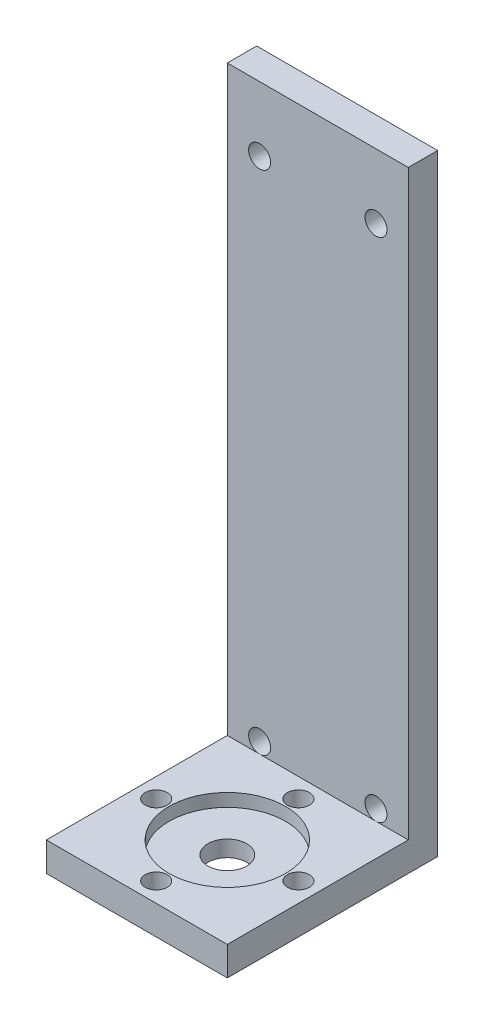
ISO-10303-21;
HEADER;
FILE_DESCRIPTION(('STEP AP214'),'2;1');
FILE_NAME('part.step','',(''),(''),'','','');
FILE_SCHEMA(('AUTOMOTIVE_DESIGN { 1 0 10303 214 1 1 1 1 }'));
ENDSEC;
DATA;
#1=APPLICATION_CONTEXT('core data for automotive mechanical design processes');
#2=APPLICATION_PROTOCOL_DEFINITION('international standard','automotive_design',2000,#1);
#3=PRODUCT_CONTEXT('',#1,'mechanical');
#4=PRODUCT('Part','Part','',(#3));
#5=PRODUCT_RELATED_PRODUCT_CATEGORY('part','',(#4));
#6=PRODUCT_DEFINITION_FORMATION('','',#4);
#7=PRODUCT_DEFINITION_CONTEXT('part definition',#1,'design');
#8=PRODUCT_DEFINITION('design','',#6,#7);
#9=PRODUCT_DEFINITION_SHAPE('','',#8);
#10=(LENGTH_UNIT() NAMED_UNIT(*) SI_UNIT(.MILLI.,.METRE.));
#11=(NAMED_UNIT(*) PLANE_ANGLE_UNIT() SI_UNIT($,.RADIAN.));
#12=(NAMED_UNIT(*) SI_UNIT($,.STERADIAN.) SOLID_ANGLE_UNIT());
#13=UNCERTAINTY_MEASURE_WITH_UNIT(LENGTH_MEASURE(1.E-05),#10,'distance_accuracy_value','');
#14=(GEOMETRIC_REPRESENTATION_CONTEXT(3) GLOBAL_UNCERTAINTY_ASSIGNED_CONTEXT((#13)) GLOBAL_UNIT_ASSIGNED_CONTEXT((#10,
#11,#12)) REPRESENTATION_CONTEXT('',''));
#15=CARTESIAN_POINT('',(0.,0.,0.));
#16=DIRECTION('',(0.,0.,1.));
#17=DIRECTION('',(1.,0.,0.));
#18=AXIS2_PLACEMENT_3D('',#15,#16,#17);
#19=CARTESIAN_POINT('',(14.,4.5,-14.));
#20=DIRECTION('',(0.,-1.,0.));
#21=DIRECTION('',(0.,0.,-1.));
#22=AXIS2_PLACEMENT_3D('',#19,#20,#21);
#23=CYLINDRICAL_SURFACE('',#22,3.);
#24=CARTESIAN_POINT('',(14.,0.,-14.));
#25=DIRECTION('',(0.,1.,0.));
#26=DIRECTION('',(0.,0.,1.));
#27=AXIS2_PLACEMENT_3D('',#24,#25,#26);
#28=CIRCLE('',#27,3.);
#29=CARTESIAN_POINT('',(14.,0.,-11.));
#30=VERTEX_POINT('',#29);
#31=EDGE_CURVE('E273',#30,#30,#28,.T.);
#32=ORIENTED_EDGE('',*,*,#31,.F.);
#33=EDGE_LOOP('',(#32));
#34=FACE_BOUND('',#33,.T.);
#35=CARTESIAN_POINT('',(14.,2.5,-14.));
#36=DIRECTION('',(0.,1.,0.));
#37=DIRECTION('',(0.,0.,1.));
#38=AXIS2_PLACEMENT_3D('',#35,#36,#37);
#39=CIRCLE('',#38,3.);
#40=CARTESIAN_POINT('',(14.,2.5,-11.));
#41=VERTEX_POINT('',#40);
#42=EDGE_CURVE('E134',#41,#41,#39,.T.);
#43=ORIENTED_EDGE('',*,*,#42,.T.);
#44=EDGE_LOOP('',(#43));
#45=FACE_BOUND('',#44,.T.);
#46=ADVANCED_FACE('F129',(#34,#45),#23,.F.);
#47=CARTESIAN_POINT('',(0.,4.5,0.));
#48=DIRECTION('',(0.,-1.,0.));
#49=DIRECTION('',(0.,0.,-1.));
#50=AXIS2_PLACEMENT_3D('',#47,#48,#49);
#51=PLANE('',#50);
#52=CARTESIAN_POINT('',(14.,4.5,-14.));
#53=DIRECTION('',(0.,1.,0.));
#54=DIRECTION('',(0.,0.,1.));
#55=AXIS2_PLACEMENT_3D('',#52,#53,#54);
#56=CIRCLE('',#55,9.);
#57=CARTESIAN_POINT('',(14.,4.5,-5.));
#58=VERTEX_POINT('',#57);
#59=EDGE_CURVE('E379',#58,#58,#56,.T.);
#60=ORIENTED_EDGE('',*,*,#59,.F.);
#61=EDGE_LOOP('',(#60));
#62=FACE_BOUND('',#61,.T.);
#63=DIRECTION('',(0.,0.,1.));
#64=VECTOR('',#63,1.);
#65=CARTESIAN_POINT('',(0.,4.5,0.));
#66=LINE('',#65,#64);
#67=CARTESIAN_POINT('',(0.,4.5,-28.));
#68=VERTEX_POINT('',#67);
#69=CARTESIAN_POINT('',(0.,4.5,0.));
#70=VERTEX_POINT('',#69);
#71=EDGE_CURVE('E200',#68,#70,#66,.T.);
#72=ORIENTED_EDGE('',*,*,#71,.T.);
#73=DIRECTION('',(1.,0.,0.));
#74=VECTOR('',#73,1.);
#75=CARTESIAN_POINT('',(0.,4.5,0.));
#76=LINE('',#75,#74);
#77=CARTESIAN_POINT('',(28.,4.5,0.));
#78=VERTEX_POINT('',#77);
#79=EDGE_CURVE('E283',#70,#78,#76,.T.);
#80=ORIENTED_EDGE('',*,*,#79,.T.);
#81=DIRECTION('',(0.,0.,-1.));
#82=VECTOR('',#81,1.);
#83=CARTESIAN_POINT('',(28.,4.5,0.));
#84=LINE('',#83,#82);
#85=CARTESIAN_POINT('',(28.,4.5,-28.));
#86=VERTEX_POINT('',#85);
#87=EDGE_CURVE('E290',#78,#86,#84,.T.);
#88=ORIENTED_EDGE('',*,*,#87,.T.);
#89=DIRECTION('',(-1.,0.,0.));
#90=VECTOR('',#89,1.);
#91=CARTESIAN_POINT('',(0.,4.5,-28.));
#92=LINE('',#91,#90);
#93=CARTESIAN_POINT('',(23.,4.5,-28.));
#94=VERTEX_POINT('',#93);
#95=EDGE_CURVE('E295',#86,#94,#92,.T.);
#96=ORIENTED_EDGE('',*,*,#95,.T.);
#97=CARTESIAN_POINT('',(5.00000000000003,4.5,-28.));
#98=VERTEX_POINT('',#97);
#99=EDGE_CURVE('E296',#94,#98,#92,.T.);
#100=ORIENTED_EDGE('',*,*,#99,.T.);
#101=EDGE_CURVE('E292',#98,#68,#92,.T.);
#102=ORIENTED_EDGE('',*,*,#101,.T.);
#103=EDGE_LOOP('',(#72,#80,#88,#96,#100,#102));
#104=FACE_BOUND('',#103,.T.);
#105=CARTESIAN_POINT('',(14.,4.5,-25.));
#106=DIRECTION('',(0.,1.,0.));
#107=DIRECTION('',(0.,0.,1.));
#108=AXIS2_PLACEMENT_3D('',#105,#106,#107);
#109=CIRCLE('',#108,1.7);
#110=CARTESIAN_POINT('',(14.,4.5,-23.3));
#111=VERTEX_POINT('',#110);
#112=EDGE_CURVE('E269',#111,#111,#109,.T.);
#113=ORIENTED_EDGE('',*,*,#112,.F.);
#114=EDGE_LOOP('',(#113));
#115=FACE_BOUND('',#114,.T.);
#116=CARTESIAN_POINT('',(25.,4.5,-14.));
#117=DIRECTION('',(0.,1.,0.));
#118=DIRECTION('',(0.,0.,1.));
#119=AXIS2_PLACEMENT_3D('',#116,#117,#118);
#120=CIRCLE('',#119,1.7);
#121=CARTESIAN_POINT('',(25.,4.5,-12.3));
#122=VERTEX_POINT('',#121);
#123=EDGE_CURVE('E265',#122,#122,#120,.T.);
#124=ORIENTED_EDGE('',*,*,#123,.F.);
#125=EDGE_LOOP('',(#124));
#126=FACE_BOUND('',#125,.T.);
#127=CARTESIAN_POINT('',(14.,4.5,-3.));
#128=DIRECTION('',(0.,1.,0.));
#129=DIRECTION('',(0.,0.,1.));
#130=AXIS2_PLACEMENT_3D('',#127,#128,#129);
#131=CIRCLE('',#130,1.7);
#132=CARTESIAN_POINT('',(14.,4.5,-1.3));
#133=VERTEX_POINT('',#132);
#134=EDGE_CURVE('E255',#133,#133,#131,.T.);
#135=ORIENTED_EDGE('',*,*,#134,.F.);
#136=EDGE_LOOP('',(#135));
#137=FACE_BOUND('',#136,.T.);
#138=CARTESIAN_POINT('',(3.,4.5,-14.));
#139=DIRECTION('',(0.,1.,0.));
#140=DIRECTION('',(0.,0.,1.));
#141=AXIS2_PLACEMENT_3D('',#138,#139,#140);
#142=CIRCLE('',#141,1.7);
#143=CARTESIAN_POINT('',(3.,4.5,-12.3));
#144=VERTEX_POINT('',#143);
#145=EDGE_CURVE('E248',#144,#144,#142,.T.);
#146=ORIENTED_EDGE('',*,*,#145,.F.);
#147=EDGE_LOOP('',(#146));
#148=FACE_BOUND('',#147,.T.);
#149=ADVANCED_FACE('F334',(#62,#104,#115,#126,#137,#148),#51,.F.);
#150=CARTESIAN_POINT('',(0.,0.,0.));
#151=DIRECTION('',(0.,-1.,0.));
#152=DIRECTION('',(0.,0.,-1.));
#153=AXIS2_PLACEMENT_3D('',#150,#151,#152);
#154=PLANE('',#153);
#155=CARTESIAN_POINT('',(14.,0.,-3.));
#156=DIRECTION('',(0.,1.,0.));
#157=DIRECTION('',(0.,0.,1.));
#158=AXIS2_PLACEMENT_3D('',#155,#156,#157);
#159=CIRCLE('',#158,1.7);
#160=CARTESIAN_POINT('',(14.,0.,-1.3));
#161=VERTEX_POINT('',#160);
#162=EDGE_CURVE('E249',#161,#161,#159,.T.);
#163=ORIENTED_EDGE('',*,*,#162,.T.);
#164=EDGE_LOOP('',(#163));
#165=FACE_BOUND('',#164,.T.);
#166=CARTESIAN_POINT('',(14.,0.,-25.));
#167=DIRECTION('',(0.,1.,0.));
#168=DIRECTION('',(0.,0.,1.));
#169=AXIS2_PLACEMENT_3D('',#166,#167,#168);
#170=CIRCLE('',#169,1.7);
#171=CARTESIAN_POINT('',(14.,0.,-23.3));
#172=VERTEX_POINT('',#171);
#173=EDGE_CURVE('E266',#172,#172,#170,.T.);
#174=ORIENTED_EDGE('',*,*,#173,.T.);
#175=EDGE_LOOP('',(#174));
#176=FACE_BOUND('',#175,.T.);
#177=DIRECTION('',(0.,0.,1.));
#178=VECTOR('',#177,1.);
#179=CARTESIAN_POINT('',(0.,0.,0.));
#180=LINE('',#179,#178);
#181=CARTESIAN_POINT('',(0.,0.,-32.545037205827));
#182=VERTEX_POINT('',#181);
#183=CARTESIAN_POINT('',(0.,0.,0.));
#184=VERTEX_POINT('',#183);
#185=EDGE_CURVE('E210',#182,#184,#180,.T.);
#186=ORIENTED_EDGE('',*,*,#185,.F.);
#187=DIRECTION('',(-1.,0.,0.));
#188=VECTOR('',#187,1.);
#189=CARTESIAN_POINT('',(28.,0.,-32.545037205827));
#190=LINE('',#189,#188);
#191=CARTESIAN_POINT('',(28.,0.,-32.545037205827));
#192=VERTEX_POINT('',#191);
#193=EDGE_CURVE('E201',#192,#182,#190,.T.);
#194=ORIENTED_EDGE('',*,*,#193,.F.);
#195=DIRECTION('',(0.,0.,-1.));
#196=VECTOR('',#195,1.);
#197=CARTESIAN_POINT('',(28.,0.,0.));
#198=LINE('',#197,#196);
#199=CARTESIAN_POINT('',(28.,0.,0.));
#200=VERTEX_POINT('',#199);
#201=EDGE_CURVE('E188',#200,#192,#198,.T.);
#202=ORIENTED_EDGE('',*,*,#201,.F.);
#203=DIRECTION('',(1.,0.,0.));
#204=VECTOR('',#203,1.);
#205=CARTESIAN_POINT('',(0.,0.,0.));
#206=LINE('',#205,#204);
#207=EDGE_CURVE('E199',#184,#200,#206,.T.);
#208=ORIENTED_EDGE('',*,*,#207,.F.);
#209=EDGE_LOOP('',(#186,#194,#202,#208));
#210=FACE_BOUND('',#209,.T.);
#211=ORIENTED_EDGE('',*,*,#31,.T.);
#212=EDGE_LOOP('',(#211));
#213=FACE_BOUND('',#212,.T.);
#214=CARTESIAN_POINT('',(25.,0.,-14.));
#215=DIRECTION('',(0.,1.,0.));
#216=DIRECTION('',(0.,0.,1.));
#217=AXIS2_PLACEMENT_3D('',#214,#215,#216);
#218=CIRCLE('',#217,1.7);
#219=CARTESIAN_POINT('',(25.,0.,-12.3));
#220=VERTEX_POINT('',#219);
#221=EDGE_CURVE('E256',#220,#220,#218,.T.);
#222=ORIENTED_EDGE('',*,*,#221,.T.);
#223=EDGE_LOOP('',(#222));
#224=FACE_BOUND('',#223,.T.);
#225=CARTESIAN_POINT('',(3.,0.,-14.));
#226=DIRECTION('',(0.,1.,0.));
#227=DIRECTION('',(0.,0.,1.));
#228=AXIS2_PLACEMENT_3D('',#225,#226,#227);
#229=CIRCLE('',#228,1.7);
#230=CARTESIAN_POINT('',(3.,0.,-12.3));
#231=VERTEX_POINT('',#230);
#232=EDGE_CURVE('E245',#231,#231,#229,.T.);
#233=ORIENTED_EDGE('',*,*,#232,.T.);
#234=EDGE_LOOP('',(#233));
#235=FACE_BOUND('',#234,.T.);
#236=ADVANCED_FACE('F204',(#165,#176,#210,#213,#224,#235),#154,.T.);
#237=CARTESIAN_POINT('',(0.,4.5,0.));
#238=DIRECTION('',(1.,0.,0.));
#239=DIRECTION('',(0.,0.,-1.));
#240=AXIS2_PLACEMENT_3D('',#237,#238,#239);
#241=PLANE('',#240);
#242=ORIENTED_EDGE('',*,*,#185,.T.);
#243=DIRECTION('',(0.,-1.,0.));
#244=VECTOR('',#243,1.);
#245=CARTESIAN_POINT('',(0.,4.5,0.));
#246=LINE('',#245,#244);
#247=EDGE_CURVE('E12',#70,#184,#246,.T.);
#248=ORIENTED_EDGE('',*,*,#247,.F.);
#249=ORIENTED_EDGE('',*,*,#71,.F.);
#250=DIRECTION('',(0.,1.,0.));
#251=VECTOR('',#250,1.);
#252=CARTESIAN_POINT('',(0.,0.,-28.));
#253=LINE('',#252,#251);
#254=CARTESIAN_POINT('',(0.,94.6,-28.));
#255=VERTEX_POINT('',#254);
#256=EDGE_CURVE('E225',#68,#255,#253,.T.);
#257=ORIENTED_EDGE('',*,*,#256,.T.);
#258=DIRECTION('',(0.,0.,1.));
#259=VECTOR('',#258,1.);
#260=CARTESIAN_POINT('',(0.,94.6,-32.545037205827));
#261=LINE('',#260,#259);
#262=CARTESIAN_POINT('',(0.,94.6,-32.545037205827));
#263=VERTEX_POINT('',#262);
#264=EDGE_CURVE('E241',#263,#255,#261,.T.);
#265=ORIENTED_EDGE('',*,*,#264,.F.);
#266=DIRECTION('',(0.,1.,0.));
#267=VECTOR('',#266,1.);
#268=CARTESIAN_POINT('',(0.,0.,-32.545037205827));
#269=LINE('',#268,#267);
#270=EDGE_CURVE('E211',#182,#263,#269,.T.);
#271=ORIENTED_EDGE('',*,*,#270,.F.);
#272=EDGE_LOOP('',(#242,#248,#249,#257,#265,#271));
#273=FACE_BOUND('',#272,.T.);
#274=ADVANCED_FACE('F131',(#273),#241,.F.);
#275=CARTESIAN_POINT('',(0.,4.5,0.));
#276=DIRECTION('',(0.,0.,-1.));
#277=DIRECTION('',(-1.,0.,0.));
#278=AXIS2_PLACEMENT_3D('',#275,#276,#277);
#279=PLANE('',#278);
#280=ORIENTED_EDGE('',*,*,#207,.T.);
#281=DIRECTION('',(0.,-1.,0.));
#282=VECTOR('',#281,1.);
#283=CARTESIAN_POINT('',(28.,4.5,0.));
#284=LINE('',#283,#282);
#285=EDGE_CURVE('E137',#78,#200,#284,.T.);
#286=ORIENTED_EDGE('',*,*,#285,.F.);
#287=ORIENTED_EDGE('',*,*,#79,.F.);
#288=ORIENTED_EDGE('',*,*,#247,.T.);
#289=EDGE_LOOP('',(#280,#286,#287,#288));
#290=FACE_BOUND('',#289,.T.);
#291=ADVANCED_FACE('F341',(#290),#279,.F.);
#292=CARTESIAN_POINT('',(28.,4.5,0.));
#293=DIRECTION('',(-1.,0.,0.));
#294=DIRECTION('',(0.,0.,1.));
#295=AXIS2_PLACEMENT_3D('',#292,#293,#294);
#296=PLANE('',#295);
#297=ORIENTED_EDGE('',*,*,#201,.T.);
#298=DIRECTION('',(0.,-1.,0.));
#299=VECTOR('',#298,1.);
#300=CARTESIAN_POINT('',(28.,0.,-32.545037205827));
#301=LINE('',#300,#299);
#302=CARTESIAN_POINT('',(28.,94.6,-32.545037205827));
#303=VERTEX_POINT('',#302);
#304=EDGE_CURVE('E192',#303,#192,#301,.T.);
#305=ORIENTED_EDGE('',*,*,#304,.F.);
#306=DIRECTION('',(0.,0.,1.));
#307=VECTOR('',#306,1.);
#308=CARTESIAN_POINT('',(28.,94.6,-32.545037205827));
#309=LINE('',#308,#307);
#310=CARTESIAN_POINT('',(28.,94.6,-28.));
#311=VERTEX_POINT('',#310);
#312=EDGE_CURVE('E232',#303,#311,#309,.T.);
#313=ORIENTED_EDGE('',*,*,#312,.T.);
#314=DIRECTION('',(0.,-1.,0.));
#315=VECTOR('',#314,1.);
#316=CARTESIAN_POINT('',(28.,0.,-28.));
#317=LINE('',#316,#315);
#318=EDGE_CURVE('E235',#311,#86,#317,.T.);
#319=ORIENTED_EDGE('',*,*,#318,.T.);
#320=ORIENTED_EDGE('',*,*,#87,.F.);
#321=ORIENTED_EDGE('',*,*,#285,.T.);
#322=EDGE_LOOP('',(#297,#305,#313,#319,#320,#321));
#323=FACE_BOUND('',#322,.T.);
#324=ADVANCED_FACE('F193',(#323),#296,.F.);
#325=CARTESIAN_POINT('',(14.,4.5,-25.));
#326=DIRECTION('',(0.,-1.,0.));
#327=DIRECTION('',(0.,0.,-1.));
#328=AXIS2_PLACEMENT_3D('',#325,#326,#327);
#329=CYLINDRICAL_SURFACE('',#328,1.7);
#330=ORIENTED_EDGE('',*,*,#112,.T.);
#331=EDGE_LOOP('',(#330));
#332=FACE_BOUND('',#331,.T.);
#333=ORIENTED_EDGE('',*,*,#173,.F.);
#334=EDGE_LOOP('',(#333));
#335=FACE_BOUND('',#334,.T.);
#336=ADVANCED_FACE('F417',(#332,#335),#329,.F.);
#337=CARTESIAN_POINT('',(25.,4.5,-14.));
#338=DIRECTION('',(0.,-1.,0.));
#339=DIRECTION('',(0.,0.,-1.));
#340=AXIS2_PLACEMENT_3D('',#337,#338,#339);
#341=CYLINDRICAL_SURFACE('',#340,1.7);
#342=ORIENTED_EDGE('',*,*,#123,.T.);
#343=EDGE_LOOP('',(#342));
#344=FACE_BOUND('',#343,.T.);
#345=ORIENTED_EDGE('',*,*,#221,.F.);
#346=EDGE_LOOP('',(#345));
#347=FACE_BOUND('',#346,.T.);
#348=ADVANCED_FACE('F547',(#344,#347),#341,.F.);
#349=CARTESIAN_POINT('',(14.,4.5,-3.));
#350=DIRECTION('',(0.,-1.,0.));
#351=DIRECTION('',(0.,0.,-1.));
#352=AXIS2_PLACEMENT_3D('',#349,#350,#351);
#353=CYLINDRICAL_SURFACE('',#352,1.7);
#354=ORIENTED_EDGE('',*,*,#134,.T.);
#355=EDGE_LOOP('',(#354));
#356=FACE_BOUND('',#355,.T.);
#357=ORIENTED_EDGE('',*,*,#162,.F.);
#358=EDGE_LOOP('',(#357));
#359=FACE_BOUND('',#358,.T.);
#360=ADVANCED_FACE('F557',(#356,#359),#353,.F.);
#361=CARTESIAN_POINT('',(3.,4.5,-14.));
#362=DIRECTION('',(0.,-1.,0.));
#363=DIRECTION('',(0.,0.,-1.));
#364=AXIS2_PLACEMENT_3D('',#361,#362,#363);
#365=CYLINDRICAL_SURFACE('',#364,1.7);
#366=ORIENTED_EDGE('',*,*,#145,.T.);
#367=EDGE_LOOP('',(#366));
#368=FACE_BOUND('',#367,.T.);
#369=ORIENTED_EDGE('',*,*,#232,.F.);
#370=EDGE_LOOP('',(#369));
#371=FACE_BOUND('',#370,.T.);
#372=ADVANCED_FACE('F457',(#368,#371),#365,.F.);
#373=CARTESIAN_POINT('',(0.,0.,-28.));
#374=DIRECTION('',(0.,0.,1.));
#375=DIRECTION('',(1.,0.,0.));
#376=AXIS2_PLACEMENT_3D('',#373,#374,#375);
#377=PLANE('',#376);
#378=CARTESIAN_POINT('',(5.00000000000002,84.6,-28.));
#379=DIRECTION('',(0.,0.,1.));
#380=DIRECTION('',(1.,0.,0.));
#381=AXIS2_PLACEMENT_3D('',#378,#379,#380);
#382=CIRCLE('',#381,1.70000000000001);
#383=CARTESIAN_POINT('',(6.70000000000002,84.6,-28.));
#384=VERTEX_POINT('',#383);
#385=EDGE_CURVE('E353',#384,#384,#382,.T.);
#386=ORIENTED_EDGE('',*,*,#385,.F.);
#387=EDGE_LOOP('',(#386));
#388=FACE_BOUND('',#387,.T.);
#389=CARTESIAN_POINT('',(23.,84.6,-28.));
#390=DIRECTION('',(0.,0.,1.));
#391=DIRECTION('',(-1.,0.,0.));
#392=AXIS2_PLACEMENT_3D('',#389,#390,#391);
#393=CIRCLE('',#392,1.7);
#394=CARTESIAN_POINT('',(21.3,84.6,-28.));
#395=VERTEX_POINT('',#394);
#396=EDGE_CURVE('E360',#395,#395,#393,.T.);
#397=ORIENTED_EDGE('',*,*,#396,.F.);
#398=EDGE_LOOP('',(#397));
#399=FACE_BOUND('',#398,.T.);
#400=ORIENTED_EDGE('',*,*,#99,.F.);
#401=CARTESIAN_POINT('',(23.,6.2,-28.));
#402=DIRECTION('',(0.,0.,1.));
#403=DIRECTION('',(-1.,0.,0.));
#404=AXIS2_PLACEMENT_3D('',#401,#402,#403);
#405=CIRCLE('',#404,1.7);
#406=EDGE_CURVE('E149',#94,#94,#405,.T.);
#407=ORIENTED_EDGE('',*,*,#406,.F.);
#408=ORIENTED_EDGE('',*,*,#95,.F.);
#409=ORIENTED_EDGE('',*,*,#318,.F.);
#410=DIRECTION('',(1.,0.,0.));
#411=VECTOR('',#410,1.);
#412=CARTESIAN_POINT('',(28.,94.6,-28.));
#413=LINE('',#412,#411);
#414=EDGE_CURVE('E217',#255,#311,#413,.T.);
#415=ORIENTED_EDGE('',*,*,#414,.F.);
#416=ORIENTED_EDGE('',*,*,#256,.F.);
#417=ORIENTED_EDGE('',*,*,#101,.F.);
#418=CARTESIAN_POINT('',(5.00000000000003,6.2,-28.));
#419=DIRECTION('',(0.,0.,1.));
#420=DIRECTION('',(1.,0.,0.));
#421=AXIS2_PLACEMENT_3D('',#418,#419,#420);
#422=CIRCLE('',#421,1.7);
#423=EDGE_CURVE('E145',#98,#98,#422,.T.);
#424=ORIENTED_EDGE('',*,*,#423,.F.);
#425=EDGE_LOOP('',(#400,#407,#408,#409,#415,#416,#417,#424));
#426=FACE_BOUND('',#425,.T.);
#427=ADVANCED_FACE('F340',(#388,#399,#426),#377,.T.);
#428=CARTESIAN_POINT('',(28.,94.6,-32.545037205827));
#429=DIRECTION('',(0.,-1.,0.));
#430=DIRECTION('',(0.,0.,-1.));
#431=AXIS2_PLACEMENT_3D('',#428,#429,#430);
#432=PLANE('',#431);
#433=ORIENTED_EDGE('',*,*,#414,.T.);
#434=ORIENTED_EDGE('',*,*,#312,.F.);
#435=DIRECTION('',(1.,0.,0.));
#436=VECTOR('',#435,1.);
#437=CARTESIAN_POINT('',(28.,94.6,-32.545037205827));
#438=LINE('',#437,#436);
#439=EDGE_CURVE('E214',#263,#303,#438,.T.);
#440=ORIENTED_EDGE('',*,*,#439,.F.);
#441=ORIENTED_EDGE('',*,*,#264,.T.);
#442=EDGE_LOOP('',(#433,#434,#440,#441));
#443=FACE_BOUND('',#442,.T.);
#444=ADVANCED_FACE('F441',(#443),#432,.F.);
#445=CARTESIAN_POINT('',(0.,0.,-32.545037205827));
#446=DIRECTION('',(0.,0.,1.));
#447=DIRECTION('',(1.,0.,0.));
#448=AXIS2_PLACEMENT_3D('',#445,#446,#447);
#449=PLANE('',#448);
#450=CARTESIAN_POINT('',(5.00000000000002,84.6,-32.545037205827));
#451=DIRECTION('',(0.,0.,1.));
#452=DIRECTION('',(1.,0.,0.));
#453=AXIS2_PLACEMENT_3D('',#450,#451,#452);
#454=CIRCLE('',#453,1.70000000000001);
#455=CARTESIAN_POINT('',(6.70000000000002,84.6,-32.545037205827));
#456=VERTEX_POINT('',#455);
#457=EDGE_CURVE('E350',#456,#456,#454,.T.);
#458=ORIENTED_EDGE('',*,*,#457,.T.);
#459=EDGE_LOOP('',(#458));
#460=FACE_BOUND('',#459,.T.);
#461=CARTESIAN_POINT('',(23.,6.2,-32.545037205827));
#462=DIRECTION('',(0.,0.,1.));
#463=DIRECTION('',(-1.,0.,0.));
#464=AXIS2_PLACEMENT_3D('',#461,#462,#463);
#465=CIRCLE('',#464,1.7);
#466=CARTESIAN_POINT('',(21.3,6.2,-32.545037205827));
#467=VERTEX_POINT('',#466);
#468=EDGE_CURVE('E346',#467,#467,#465,.T.);
#469=ORIENTED_EDGE('',*,*,#468,.T.);
#470=EDGE_LOOP('',(#469));
#471=FACE_BOUND('',#470,.T.);
#472=CARTESIAN_POINT('',(23.,84.6,-32.545037205827));
#473=DIRECTION('',(0.,0.,1.));
#474=DIRECTION('',(-1.,0.,0.));
#475=AXIS2_PLACEMENT_3D('',#472,#473,#474);
#476=CIRCLE('',#475,1.7);
#477=CARTESIAN_POINT('',(21.3,84.6,-32.545037205827));
#478=VERTEX_POINT('',#477);
#479=EDGE_CURVE('E373',#478,#478,#476,.T.);
#480=ORIENTED_EDGE('',*,*,#479,.T.);
#481=EDGE_LOOP('',(#480));
#482=FACE_BOUND('',#481,.T.);
#483=CARTESIAN_POINT('',(5.00000000000003,6.2,-32.545037205827));
#484=DIRECTION('',(0.,0.,1.));
#485=DIRECTION('',(1.,0.,0.));
#486=AXIS2_PLACEMENT_3D('',#483,#484,#485);
#487=CIRCLE('',#486,1.7);
#488=CARTESIAN_POINT('',(6.70000000000003,6.2,-32.545037205827));
#489=VERTEX_POINT('',#488);
#490=EDGE_CURVE('E237',#489,#489,#487,.T.);
#491=ORIENTED_EDGE('',*,*,#490,.T.);
#492=EDGE_LOOP('',(#491));
#493=FACE_BOUND('',#492,.T.);
#494=ORIENTED_EDGE('',*,*,#304,.T.);
#495=ORIENTED_EDGE('',*,*,#193,.T.);
#496=ORIENTED_EDGE('',*,*,#270,.T.);
#497=ORIENTED_EDGE('',*,*,#439,.T.);
#498=EDGE_LOOP('',(#494,#495,#496,#497));
#499=FACE_BOUND('',#498,.T.);
#500=ADVANCED_FACE('F213',(#460,#471,#482,#493,#499),#449,.F.);
#501=CARTESIAN_POINT('',(5.00000000000003,6.2,-32.545037205827));
#502=DIRECTION('',(0.,0.,1.));
#503=DIRECTION('',(1.,0.,0.));
#504=AXIS2_PLACEMENT_3D('',#501,#502,#503);
#505=CYLINDRICAL_SURFACE('',#504,1.7);
#506=ORIENTED_EDGE('',*,*,#490,.F.);
#507=EDGE_LOOP('',(#506));
#508=FACE_BOUND('',#507,.T.);
#509=ORIENTED_EDGE('',*,*,#423,.T.);
#510=EDGE_LOOP('',(#509));
#511=FACE_BOUND('',#510,.T.);
#512=ADVANCED_FACE('F463',(#508,#511),#505,.F.);
#513=CARTESIAN_POINT('',(23.,84.6,-32.545037205827));
#514=DIRECTION('',(0.,0.,1.));
#515=DIRECTION('',(1.,0.,0.));
#516=AXIS2_PLACEMENT_3D('',#513,#514,#515);
#517=CYLINDRICAL_SURFACE('',#516,1.7);
#518=ORIENTED_EDGE('',*,*,#479,.F.);
#519=EDGE_LOOP('',(#518));
#520=FACE_BOUND('',#519,.T.);
#521=ORIENTED_EDGE('',*,*,#396,.T.);
#522=EDGE_LOOP('',(#521));
#523=FACE_BOUND('',#522,.T.);
#524=ADVANCED_FACE('F471',(#520,#523),#517,.F.);
#525=CARTESIAN_POINT('',(23.,6.2,-32.545037205827));
#526=DIRECTION('',(0.,0.,1.));
#527=DIRECTION('',(1.,0.,0.));
#528=AXIS2_PLACEMENT_3D('',#525,#526,#527);
#529=CYLINDRICAL_SURFACE('',#528,1.7);
#530=ORIENTED_EDGE('',*,*,#468,.F.);
#531=EDGE_LOOP('',(#530));
#532=FACE_BOUND('',#531,.T.);
#533=ORIENTED_EDGE('',*,*,#406,.T.);
#534=EDGE_LOOP('',(#533));
#535=FACE_BOUND('',#534,.T.);
#536=ADVANCED_FACE('F485',(#532,#535),#529,.F.);
#537=CARTESIAN_POINT('',(5.00000000000002,84.6,-32.545037205827));
#538=DIRECTION('',(0.,0.,1.));
#539=DIRECTION('',(1.,0.,0.));
#540=AXIS2_PLACEMENT_3D('',#537,#538,#539);
#541=CYLINDRICAL_SURFACE('',#540,1.70000000000001);
#542=ORIENTED_EDGE('',*,*,#457,.F.);
#543=EDGE_LOOP('',(#542));
#544=FACE_BOUND('',#543,.T.);
#545=ORIENTED_EDGE('',*,*,#385,.T.);
#546=EDGE_LOOP('',(#545));
#547=FACE_BOUND('',#546,.T.);
#548=ADVANCED_FACE('F401',(#544,#547),#541,.F.);
#549=CARTESIAN_POINT('',(14.,2.5,-14.));
#550=DIRECTION('',(0.,1.,0.));
#551=DIRECTION('',(0.,0.,1.));
#552=AXIS2_PLACEMENT_3D('',#549,#550,#551);
#553=CYLINDRICAL_SURFACE('',#552,9.);
#554=CARTESIAN_POINT('',(14.,2.5,-14.));
#555=DIRECTION('',(0.,1.,0.));
#556=DIRECTION('',(0.,0.,1.));
#557=AXIS2_PLACEMENT_3D('',#554,#555,#556);
#558=CIRCLE('',#557,9.);
#559=CARTESIAN_POINT('',(14.,2.5,-5.));
#560=VERTEX_POINT('',#559);
#561=EDGE_CURVE('E383',#560,#560,#558,.T.);
#562=ORIENTED_EDGE('',*,*,#561,.F.);
#563=EDGE_LOOP('',(#562));
#564=FACE_BOUND('',#563,.T.);
#565=ORIENTED_EDGE('',*,*,#59,.T.);
#566=EDGE_LOOP('',(#565));
#567=FACE_BOUND('',#566,.T.);
#568=ADVANCED_FACE('F398',(#564,#567),#553,.F.);
#569=CARTESIAN_POINT('',(14.,2.5,-14.));
#570=DIRECTION('',(0.,1.,0.));
#571=DIRECTION('',(0.,0.,1.));
#572=AXIS2_PLACEMENT_3D('',#569,#570,#571);
#573=PLANE('',#572);
#574=ORIENTED_EDGE('',*,*,#42,.F.);
#575=EDGE_LOOP('',(#574));
#576=FACE_BOUND('',#575,.T.);
#577=ORIENTED_EDGE('',*,*,#561,.T.);
#578=EDGE_LOOP('',(#577));
#579=FACE_BOUND('',#578,.T.);
#580=ADVANCED_FACE('F397',(#576,#579),#573,.T.);
#581=CLOSED_SHELL('',(#46,#149,#236,#274,#291,#324,#336,#348,#360,#372,#427,#444,#500,#512,#524,
#536,#548,#568,#580));
#582=MANIFOLD_SOLID_BREP('B2',#581);
#583=ADVANCED_BREP_SHAPE_REPRESENTATION('',(#18,#582),#14);
#584=SHAPE_DEFINITION_REPRESENTATION(#9,#583);
ENDSEC;
END-ISO-10303-21;
